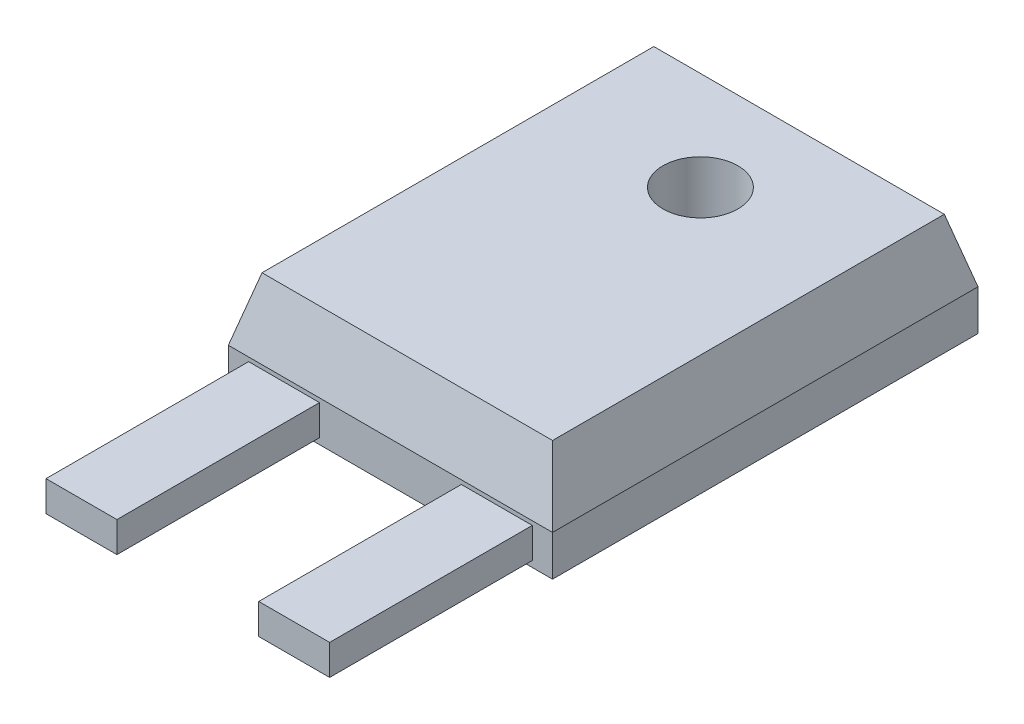
ISO-10303-21;
HEADER;
FILE_DESCRIPTION(('STEP AP214'),'2;1');
FILE_NAME('part.step','',(''),(''),'','','');
FILE_SCHEMA(('AUTOMOTIVE_DESIGN { 1 0 10303 214 1 1 1 1 }'));
ENDSEC;
DATA;
#1=APPLICATION_CONTEXT('core data for automotive mechanical design processes');
#2=APPLICATION_PROTOCOL_DEFINITION('international standard','automotive_design',2000,#1);
#3=PRODUCT_CONTEXT('',#1,'mechanical');
#4=PRODUCT('Part','Part','',(#3));
#5=PRODUCT_RELATED_PRODUCT_CATEGORY('part','',(#4));
#6=PRODUCT_DEFINITION_FORMATION('','',#4);
#7=PRODUCT_DEFINITION_CONTEXT('part definition',#1,'design');
#8=PRODUCT_DEFINITION('design','',#6,#7);
#9=PRODUCT_DEFINITION_SHAPE('','',#8);
#10=(LENGTH_UNIT() NAMED_UNIT(*) SI_UNIT(.MILLI.,.METRE.));
#11=(NAMED_UNIT(*) PLANE_ANGLE_UNIT() SI_UNIT($,.RADIAN.));
#12=(NAMED_UNIT(*) SI_UNIT($,.STERADIAN.) SOLID_ANGLE_UNIT());
#13=UNCERTAINTY_MEASURE_WITH_UNIT(LENGTH_MEASURE(1.E-05),#10,'distance_accuracy_value','');
#14=(GEOMETRIC_REPRESENTATION_CONTEXT(3) GLOBAL_UNCERTAINTY_ASSIGNED_CONTEXT((#13)) GLOBAL_UNIT_ASSIGNED_CONTEXT((#10,
#11,#12)) REPRESENTATION_CONTEXT('',''));
#15=CARTESIAN_POINT('',(0.,0.,0.));
#16=DIRECTION('',(0.,0.,1.));
#17=DIRECTION('',(1.,0.,0.));
#18=AXIS2_PLACEMENT_3D('',#15,#16,#17);
#19=CARTESIAN_POINT('',(0.,5.1,0.));
#20=DIRECTION('',(0.,0.,-1.));
#21=DIRECTION('',(-1.,0.,0.));
#22=AXIS2_PLACEMENT_3D('',#19,#20,#21);
#23=PLANE('',#22);
#24=DIRECTION('',(0.,-1.,0.));
#25=VECTOR('',#24,1.);
#26=CARTESIAN_POINT('',(1.,1.8,0.));
#27=LINE('',#26,#25);
#28=CARTESIAN_POINT('',(1.,1.8,0.));
#29=VERTEX_POINT('',#28);
#30=CARTESIAN_POINT('',(1.,0.3,0.));
#31=VERTEX_POINT('',#30);
#32=EDGE_CURVE('E227',#29,#31,#27,.T.);
#33=ORIENTED_EDGE('',*,*,#32,.F.);
#34=DIRECTION('',(-1.,0.,0.));
#35=VECTOR('',#34,1.);
#36=CARTESIAN_POINT('',(1.,1.8,0.));
#37=LINE('',#36,#35);
#38=CARTESIAN_POINT('',(4.5,1.8,0.));
#39=VERTEX_POINT('',#38);
#40=EDGE_CURVE('E232',#39,#29,#37,.T.);
#41=ORIENTED_EDGE('',*,*,#40,.F.);
#42=DIRECTION('',(0.,1.,0.));
#43=VECTOR('',#42,1.);
#44=CARTESIAN_POINT('',(4.5,1.8,0.));
#45=LINE('',#44,#43);
#46=CARTESIAN_POINT('',(4.5,0.3,0.));
#47=VERTEX_POINT('',#46);
#48=EDGE_CURVE('E244',#47,#39,#45,.T.);
#49=ORIENTED_EDGE('',*,*,#48,.F.);
#50=DIRECTION('',(1.,0.,0.));
#51=VECTOR('',#50,1.);
#52=CARTESIAN_POINT('',(1.,0.3,0.));
#53=LINE('',#52,#51);
#54=EDGE_CURVE('E241',#31,#47,#53,.T.);
#55=ORIENTED_EDGE('',*,*,#54,.F.);
#56=EDGE_LOOP('',(#33,#41,#49,#55));
#57=FACE_BOUND('',#56,.T.);
#58=DIRECTION('',(0.,-1.,0.));
#59=VECTOR('',#58,1.);
#60=CARTESIAN_POINT('',(16.,5.1,0.));
#61=LINE('',#60,#59);
#62=CARTESIAN_POINT('',(16.,1.99999999999996,0.));
#63=VERTEX_POINT('',#62);
#64=CARTESIAN_POINT('',(16.,0.,0.));
#65=VERTEX_POINT('',#64);
#66=EDGE_CURVE('E283',#63,#65,#61,.T.);
#67=ORIENTED_EDGE('',*,*,#66,.F.);
#68=DIRECTION('',(-1.,0.,0.));
#69=VECTOR('',#68,1.);
#70=CARTESIAN_POINT('',(0.,1.99999999999996,0.));
#71=LINE('',#70,#69);
#72=CARTESIAN_POINT('',(0.,1.99999999999996,0.));
#73=VERTEX_POINT('',#72);
#74=EDGE_CURVE('E296',#63,#73,#71,.T.);
#75=ORIENTED_EDGE('',*,*,#74,.T.);
#76=DIRECTION('',(0.,-1.,0.));
#77=VECTOR('',#76,1.);
#78=CARTESIAN_POINT('',(0.,5.1,0.));
#79=LINE('',#78,#77);
#80=CARTESIAN_POINT('',(0.,0.,0.));
#81=VERTEX_POINT('',#80);
#82=EDGE_CURVE('E285',#73,#81,#79,.T.);
#83=ORIENTED_EDGE('',*,*,#82,.T.);
#84=DIRECTION('',(1.,0.,0.));
#85=VECTOR('',#84,1.);
#86=CARTESIAN_POINT('',(0.,0.,0.));
#87=LINE('',#86,#85);
#88=EDGE_CURVE('E270',#81,#65,#87,.T.);
#89=ORIENTED_EDGE('',*,*,#88,.T.);
#90=EDGE_LOOP('',(#67,#75,#83,#89));
#91=FACE_BOUND('',#90,.T.);
#92=DIRECTION('',(0.,-1.,0.));
#93=VECTOR('',#92,1.);
#94=CARTESIAN_POINT('',(11.5,1.8,0.));
#95=LINE('',#94,#93);
#96=CARTESIAN_POINT('',(11.5,1.8,0.));
#97=VERTEX_POINT('',#96);
#98=CARTESIAN_POINT('',(11.5,0.3,0.));
#99=VERTEX_POINT('',#98);
#100=EDGE_CURVE('E194',#97,#99,#95,.T.);
#101=ORIENTED_EDGE('',*,*,#100,.F.);
#102=DIRECTION('',(-1.,0.,0.));
#103=VECTOR('',#102,1.);
#104=CARTESIAN_POINT('',(11.5,1.8,0.));
#105=LINE('',#104,#103);
#106=CARTESIAN_POINT('',(15.,1.8,0.));
#107=VERTEX_POINT('',#106);
#108=EDGE_CURVE('E202',#107,#97,#105,.T.);
#109=ORIENTED_EDGE('',*,*,#108,.F.);
#110=DIRECTION('',(0.,1.,0.));
#111=VECTOR('',#110,1.);
#112=CARTESIAN_POINT('',(15.,1.8,0.));
#113=LINE('',#112,#111);
#114=CARTESIAN_POINT('',(15.,0.3,0.));
#115=VERTEX_POINT('',#114);
#116=EDGE_CURVE('E212',#115,#107,#113,.T.);
#117=ORIENTED_EDGE('',*,*,#116,.F.);
#118=DIRECTION('',(1.,0.,0.));
#119=VECTOR('',#118,1.);
#120=CARTESIAN_POINT('',(11.5,0.3,0.));
#121=LINE('',#120,#119);
#122=EDGE_CURVE('E58',#99,#115,#121,.T.);
#123=ORIENTED_EDGE('',*,*,#122,.F.);
#124=EDGE_LOOP('',(#101,#109,#117,#123));
#125=FACE_BOUND('',#124,.T.);
#126=ADVANCED_FACE('F33',(#57,#91,#125),#23,.F.);
#127=CARTESIAN_POINT('',(0.,5.1,0.));
#128=DIRECTION('',(1.,0.,0.));
#129=DIRECTION('',(0.,0.,-1.));
#130=AXIS2_PLACEMENT_3D('',#127,#128,#129);
#131=PLANE('',#130);
#132=ORIENTED_EDGE('',*,*,#82,.F.);
#133=DIRECTION('',(0.,0.,-1.));
#134=VECTOR('',#133,1.);
#135=CARTESIAN_POINT('',(0.,1.99999999999996,0.));
#136=LINE('',#135,#134);
#137=CARTESIAN_POINT('',(0.,1.99999999999996,-21.));
#138=VERTEX_POINT('',#137);
#139=EDGE_CURVE('E299',#73,#138,#136,.T.);
#140=ORIENTED_EDGE('',*,*,#139,.T.);
#141=DIRECTION('',(0.,-1.,0.));
#142=VECTOR('',#141,1.);
#143=CARTESIAN_POINT('',(0.,5.1,-21.));
#144=LINE('',#143,#142);
#145=CARTESIAN_POINT('',(0.,0.,-21.));
#146=VERTEX_POINT('',#145);
#147=EDGE_CURVE('E279',#138,#146,#144,.T.);
#148=ORIENTED_EDGE('',*,*,#147,.T.);
#149=DIRECTION('',(0.,0.,1.));
#150=VECTOR('',#149,1.);
#151=CARTESIAN_POINT('',(0.,0.,0.));
#152=LINE('',#151,#150);
#153=EDGE_CURVE('E264',#146,#81,#152,.T.);
#154=ORIENTED_EDGE('',*,*,#153,.T.);
#155=EDGE_LOOP('',(#132,#140,#148,#154));
#156=FACE_BOUND('',#155,.T.);
#157=ADVANCED_FACE('F335',(#156),#131,.F.);
#158=CARTESIAN_POINT('',(16.,5.1,0.));
#159=DIRECTION('',(-1.,0.,0.));
#160=DIRECTION('',(0.,0.,1.));
#161=AXIS2_PLACEMENT_3D('',#158,#159,#160);
#162=PLANE('',#161);
#163=DIRECTION('',(0.,-1.,0.));
#164=VECTOR('',#163,1.);
#165=CARTESIAN_POINT('',(16.,5.1,-21.));
#166=LINE('',#165,#164);
#167=CARTESIAN_POINT('',(16.,1.99999999999996,-21.));
#168=VERTEX_POINT('',#167);
#169=CARTESIAN_POINT('',(16.,0.,-21.));
#170=VERTEX_POINT('',#169);
#171=EDGE_CURVE('E281',#168,#170,#166,.T.);
#172=ORIENTED_EDGE('',*,*,#171,.F.);
#173=DIRECTION('',(0.,0.,1.));
#174=VECTOR('',#173,1.);
#175=CARTESIAN_POINT('',(16.,1.99999999999996,0.));
#176=LINE('',#175,#174);
#177=EDGE_CURVE('E11',#168,#63,#176,.T.);
#178=ORIENTED_EDGE('',*,*,#177,.T.);
#179=ORIENTED_EDGE('',*,*,#66,.T.);
#180=DIRECTION('',(0.,0.,-1.));
#181=VECTOR('',#180,1.);
#182=CARTESIAN_POINT('',(16.,0.,0.));
#183=LINE('',#182,#181);
#184=EDGE_CURVE('E273',#65,#170,#183,.T.);
#185=ORIENTED_EDGE('',*,*,#184,.T.);
#186=EDGE_LOOP('',(#172,#178,#179,#185));
#187=FACE_BOUND('',#186,.T.);
#188=ADVANCED_FACE('F325',(#187),#162,.F.);
#189=CARTESIAN_POINT('',(0.,5.1,-21.));
#190=DIRECTION('',(0.,0.,1.));
#191=DIRECTION('',(1.,0.,0.));
#192=AXIS2_PLACEMENT_3D('',#189,#190,#191);
#193=PLANE('',#192);
#194=ORIENTED_EDGE('',*,*,#147,.F.);
#195=DIRECTION('',(1.,0.,0.));
#196=VECTOR('',#195,1.);
#197=CARTESIAN_POINT('',(0.,1.99999999999996,-21.));
#198=LINE('',#197,#196);
#199=EDGE_CURVE('E42',#138,#168,#198,.T.);
#200=ORIENTED_EDGE('',*,*,#199,.T.);
#201=ORIENTED_EDGE('',*,*,#171,.T.);
#202=DIRECTION('',(-1.,0.,0.));
#203=VECTOR('',#202,1.);
#204=CARTESIAN_POINT('',(0.,0.,-21.));
#205=LINE('',#204,#203);
#206=EDGE_CURVE('E276',#170,#146,#205,.T.);
#207=ORIENTED_EDGE('',*,*,#206,.T.);
#208=EDGE_LOOP('',(#194,#200,#201,#207));
#209=FACE_BOUND('',#208,.T.);
#210=ADVANCED_FACE('F323',(#209),#193,.F.);
#211=CARTESIAN_POINT('',(0.,5.1,0.));
#212=DIRECTION('',(0.,-1.,0.));
#213=DIRECTION('',(0.,0.,-1.));
#214=AXIS2_PLACEMENT_3D('',#211,#212,#213);
#215=PLANE('',#214);
#216=DIRECTION('',(0.,0.,1.));
#217=VECTOR('',#216,1.);
#218=CARTESIAN_POINT('',(0.830642496536483,5.1,0.));
#219=LINE('',#218,#217);
#220=CARTESIAN_POINT('',(0.830642496536483,5.1,-20.1693575034635));
#221=VERTEX_POINT('',#220);
#222=CARTESIAN_POINT('',(0.830642496536483,5.1,-0.830642496536483));
#223=VERTEX_POINT('',#222);
#224=EDGE_CURVE('E291',#221,#223,#219,.T.);
#225=ORIENTED_EDGE('',*,*,#224,.T.);
#226=DIRECTION('',(1.,0.,0.));
#227=VECTOR('',#226,1.);
#228=CARTESIAN_POINT('',(0.,5.1,-0.830642496536483));
#229=LINE('',#228,#227);
#230=CARTESIAN_POINT('',(15.1693575034635,5.1,-0.830642496536483));
#231=VERTEX_POINT('',#230);
#232=EDGE_CURVE('E293',#223,#231,#229,.T.);
#233=ORIENTED_EDGE('',*,*,#232,.T.);
#234=DIRECTION('',(0.,0.,-1.));
#235=VECTOR('',#234,1.);
#236=CARTESIAN_POINT('',(15.1693575034635,5.1,0.));
#237=LINE('',#236,#235);
#238=CARTESIAN_POINT('',(15.1693575034635,5.1,-20.1693575034635));
#239=VERTEX_POINT('',#238);
#240=EDGE_CURVE('E287',#231,#239,#237,.T.);
#241=ORIENTED_EDGE('',*,*,#240,.T.);
#242=DIRECTION('',(-1.,0.,0.));
#243=VECTOR('',#242,1.);
#244=CARTESIAN_POINT('',(0.,5.1,-20.1693575034635));
#245=LINE('',#244,#243);
#246=EDGE_CURVE('E289',#239,#221,#245,.T.);
#247=ORIENTED_EDGE('',*,*,#246,.T.);
#248=EDGE_LOOP('',(#225,#233,#241,#247));
#249=FACE_BOUND('',#248,.T.);
#250=CARTESIAN_POINT('',(8.,5.1,-15.3));
#251=DIRECTION('',(0.,1.,0.));
#252=DIRECTION('',(0.,0.,1.));
#253=AXIS2_PLACEMENT_3D('',#250,#251,#252);
#254=CIRCLE('',#253,1.85);
#255=CARTESIAN_POINT('',(8.,5.1,-13.45));
#256=VERTEX_POINT('',#255);
#257=EDGE_CURVE('E265',#256,#256,#254,.T.);
#258=ORIENTED_EDGE('',*,*,#257,.F.);
#259=EDGE_LOOP('',(#258));
#260=FACE_BOUND('',#259,.T.);
#261=ADVANCED_FACE('F344',(#249,#260),#215,.F.);
#262=CARTESIAN_POINT('',(0.,0.,0.));
#263=DIRECTION('',(0.,-1.,0.));
#264=DIRECTION('',(0.,0.,-1.));
#265=AXIS2_PLACEMENT_3D('',#262,#263,#264);
#266=PLANE('',#265);
#267=DIRECTION('',(0.,0.,1.));
#268=VECTOR('',#267,1.);
#269=CARTESIAN_POINT('',(14.9,0.,-12.6));
#270=LINE('',#269,#268);
#271=CARTESIAN_POINT('',(14.9,0.,-12.6));
#272=VERTEX_POINT('',#271);
#273=CARTESIAN_POINT('',(14.9,0.,-0.999999999999998));
#274=VERTEX_POINT('',#273);
#275=EDGE_CURVE('E50',#272,#274,#270,.T.);
#276=ORIENTED_EDGE('',*,*,#275,.F.);
#277=DIRECTION('',(1.,0.,0.));
#278=VECTOR('',#277,1.);
#279=CARTESIAN_POINT('',(14.9,0.,-12.6));
#280=LINE('',#279,#278);
#281=CARTESIAN_POINT('',(1.1,0.,-12.6));
#282=VERTEX_POINT('',#281);
#283=EDGE_CURVE('E179',#282,#272,#280,.T.);
#284=ORIENTED_EDGE('',*,*,#283,.F.);
#285=DIRECTION('',(0.,0.,-1.));
#286=VECTOR('',#285,1.);
#287=CARTESIAN_POINT('',(1.1,0.,-12.6));
#288=LINE('',#287,#286);
#289=CARTESIAN_POINT('',(1.1,0.,-0.999999999999998));
#290=VERTEX_POINT('',#289);
#291=EDGE_CURVE('E182',#290,#282,#288,.T.);
#292=ORIENTED_EDGE('',*,*,#291,.F.);
#293=DIRECTION('',(-1.,0.,0.));
#294=VECTOR('',#293,1.);
#295=CARTESIAN_POINT('',(14.9,0.,-0.999999999999998));
#296=LINE('',#295,#294);
#297=EDGE_CURVE('E188',#274,#290,#296,.T.);
#298=ORIENTED_EDGE('',*,*,#297,.F.);
#299=EDGE_LOOP('',(#276,#284,#292,#298));
#300=FACE_BOUND('',#299,.T.);
#301=CARTESIAN_POINT('',(8.,0.,-15.3));
#302=DIRECTION('',(0.,1.,0.));
#303=DIRECTION('',(0.,0.,1.));
#304=AXIS2_PLACEMENT_3D('',#301,#302,#303);
#305=CIRCLE('',#304,1.85);
#306=CARTESIAN_POINT('',(8.,0.,-13.45));
#307=VERTEX_POINT('',#306);
#308=EDGE_CURVE('E261',#307,#307,#305,.T.);
#309=ORIENTED_EDGE('',*,*,#308,.T.);
#310=EDGE_LOOP('',(#309));
#311=FACE_BOUND('',#310,.T.);
#312=ORIENTED_EDGE('',*,*,#153,.F.);
#313=ORIENTED_EDGE('',*,*,#206,.F.);
#314=ORIENTED_EDGE('',*,*,#184,.F.);
#315=ORIENTED_EDGE('',*,*,#88,.F.);
#316=EDGE_LOOP('',(#312,#313,#314,#315));
#317=FACE_BOUND('',#316,.T.);
#318=ADVANCED_FACE('F332',(#300,#311,#317),#266,.T.);
#319=CARTESIAN_POINT('',(8.,0.,-15.3));
#320=DIRECTION('',(0.,1.,0.));
#321=DIRECTION('',(0.,0.,1.));
#322=AXIS2_PLACEMENT_3D('',#319,#320,#321);
#323=CYLINDRICAL_SURFACE('',#322,1.85);
#324=ORIENTED_EDGE('',*,*,#308,.F.);
#325=EDGE_LOOP('',(#324));
#326=FACE_BOUND('',#325,.T.);
#327=ORIENTED_EDGE('',*,*,#257,.T.);
#328=EDGE_LOOP('',(#327));
#329=FACE_BOUND('',#328,.T.);
#330=ADVANCED_FACE('F350',(#326,#329),#323,.F.);
#331=CARTESIAN_POINT('',(0.,5.1,-20.1693575034635));
#332=DIRECTION('',(0.,-0.258819045102518,0.965925826289069));
#333=DIRECTION('',(-1.,0.,0.));
#334=AXIS2_PLACEMENT_3D('',#331,#332,#333);
#335=PLANE('',#334);
#336=DIRECTION('',(-0.25056280708573,0.935113126531031,0.250562807085729));
#337=VECTOR('',#336,1.);
#338=CARTESIAN_POINT('',(13.9030905421577,9.82577263553937,-18.9030905421577));
#339=LINE('',#338,#337);
#340=EDGE_CURVE('E304',#168,#239,#339,.T.);
#341=ORIENTED_EDGE('',*,*,#340,.F.);
#342=ORIENTED_EDGE('',*,*,#199,.F.);
#343=DIRECTION('',(0.25056280708573,0.935113126531031,0.250562807085729));
#344=VECTOR('',#343,1.);
#345=CARTESIAN_POINT('',(0.778493331654055,4.90537666708649,-20.2215066683459));
#346=LINE('',#345,#344);
#347=EDGE_CURVE('E37',#221,#138,#346,.F.);
#348=ORIENTED_EDGE('',*,*,#347,.F.);
#349=ORIENTED_EDGE('',*,*,#246,.F.);
#350=EDGE_LOOP('',(#341,#342,#348,#349));
#351=FACE_BOUND('',#350,.T.);
#352=ADVANCED_FACE('F35',(#351),#335,.F.);
#353=CARTESIAN_POINT('',(0.830642496536483,5.1,0.));
#354=DIRECTION('',(0.965925826289069,-0.258819045102518,0.));
#355=DIRECTION('',(0.,0.,1.));
#356=AXIS2_PLACEMENT_3D('',#353,#354,#355);
#357=PLANE('',#356);
#358=ORIENTED_EDGE('',*,*,#347,.T.);
#359=ORIENTED_EDGE('',*,*,#139,.F.);
#360=DIRECTION('',(0.250562807085729,0.935113126531031,-0.250562807085729));
#361=VECTOR('',#360,1.);
#362=CARTESIAN_POINT('',(0.778493331654055,4.90537666708649,-0.778493331654055));
#363=LINE('',#362,#361);
#364=EDGE_CURVE('E303',#223,#73,#363,.F.);
#365=ORIENTED_EDGE('',*,*,#364,.F.);
#366=ORIENTED_EDGE('',*,*,#224,.F.);
#367=EDGE_LOOP('',(#358,#359,#365,#366));
#368=FACE_BOUND('',#367,.T.);
#369=ADVANCED_FACE('F315',(#368),#357,.F.);
#370=CARTESIAN_POINT('',(15.1693575034635,5.1,0.));
#371=DIRECTION('',(-0.965925826289069,-0.258819045102518,0.));
#372=DIRECTION('',(0.,0.,-1.));
#373=AXIS2_PLACEMENT_3D('',#370,#371,#372);
#374=PLANE('',#373);
#375=ORIENTED_EDGE('',*,*,#340,.T.);
#376=ORIENTED_EDGE('',*,*,#240,.F.);
#377=DIRECTION('',(0.250562807085729,-0.935113126531031,0.250562807085729));
#378=VECTOR('',#377,1.);
#379=CARTESIAN_POINT('',(15.2215066683459,4.90537666708649,-0.778493331654055));
#380=LINE('',#379,#378);
#381=EDGE_CURVE('E260',#63,#231,#380,.F.);
#382=ORIENTED_EDGE('',*,*,#381,.F.);
#383=ORIENTED_EDGE('',*,*,#177,.F.);
#384=EDGE_LOOP('',(#375,#376,#382,#383));
#385=FACE_BOUND('',#384,.T.);
#386=ADVANCED_FACE('F342',(#385),#374,.F.);
#387=CARTESIAN_POINT('',(0.,5.1,-0.830642496536483));
#388=DIRECTION('',(0.,-0.258819045102518,-0.965925826289069));
#389=DIRECTION('',(1.,0.,0.));
#390=AXIS2_PLACEMENT_3D('',#387,#388,#389);
#391=PLANE('',#390);
#392=ORIENTED_EDGE('',*,*,#364,.T.);
#393=ORIENTED_EDGE('',*,*,#74,.F.);
#394=ORIENTED_EDGE('',*,*,#381,.T.);
#395=ORIENTED_EDGE('',*,*,#232,.F.);
#396=EDGE_LOOP('',(#392,#393,#394,#395));
#397=FACE_BOUND('',#396,.T.);
#398=ADVANCED_FACE('F340',(#397),#391,.F.);
#399=CARTESIAN_POINT('',(1.,1.8,10.));
#400=DIRECTION('',(1.,0.,0.));
#401=DIRECTION('',(0.,1.,0.));
#402=AXIS2_PLACEMENT_3D('',#399,#400,#401);
#403=PLANE('',#402);
#404=ORIENTED_EDGE('',*,*,#32,.T.);
#405=DIRECTION('',(0.,0.,-1.));
#406=VECTOR('',#405,1.);
#407=CARTESIAN_POINT('',(1.,0.3,10.));
#408=LINE('',#407,#406);
#409=CARTESIAN_POINT('',(1.,0.3,10.));
#410=VERTEX_POINT('',#409);
#411=EDGE_CURVE('E257',#410,#31,#408,.T.);
#412=ORIENTED_EDGE('',*,*,#411,.F.);
#413=DIRECTION('',(0.,-1.,0.));
#414=VECTOR('',#413,1.);
#415=CARTESIAN_POINT('',(1.,1.8,10.));
#416=LINE('',#415,#414);
#417=CARTESIAN_POINT('',(1.,1.8,10.));
#418=VERTEX_POINT('',#417);
#419=EDGE_CURVE('E228',#418,#410,#416,.T.);
#420=ORIENTED_EDGE('',*,*,#419,.F.);
#421=DIRECTION('',(0.,0.,-1.));
#422=VECTOR('',#421,1.);
#423=CARTESIAN_POINT('',(1.,1.8,10.));
#424=LINE('',#423,#422);
#425=EDGE_CURVE('E238',#418,#29,#424,.T.);
#426=ORIENTED_EDGE('',*,*,#425,.T.);
#427=EDGE_LOOP('',(#404,#412,#420,#426));
#428=FACE_BOUND('',#427,.T.);
#429=ADVANCED_FACE('F375',(#428),#403,.F.);
#430=CARTESIAN_POINT('',(1.,0.3,10.));
#431=DIRECTION('',(0.,1.,0.));
#432=DIRECTION('',(0.,0.,1.));
#433=AXIS2_PLACEMENT_3D('',#430,#431,#432);
#434=PLANE('',#433);
#435=ORIENTED_EDGE('',*,*,#54,.T.);
#436=DIRECTION('',(0.,0.,-1.));
#437=VECTOR('',#436,1.);
#438=CARTESIAN_POINT('',(4.5,0.3,10.));
#439=LINE('',#438,#437);
#440=CARTESIAN_POINT('',(4.5,0.3,10.));
#441=VERTEX_POINT('',#440);
#442=EDGE_CURVE('E254',#441,#47,#439,.T.);
#443=ORIENTED_EDGE('',*,*,#442,.F.);
#444=DIRECTION('',(1.,0.,0.));
#445=VECTOR('',#444,1.);
#446=CARTESIAN_POINT('',(1.,0.3,10.));
#447=LINE('',#446,#445);
#448=EDGE_CURVE('E231',#410,#441,#447,.T.);
#449=ORIENTED_EDGE('',*,*,#448,.F.);
#450=ORIENTED_EDGE('',*,*,#411,.T.);
#451=EDGE_LOOP('',(#435,#443,#449,#450));
#452=FACE_BOUND('',#451,.T.);
#453=ADVANCED_FACE('F396',(#452),#434,.F.);
#454=CARTESIAN_POINT('',(4.5,1.8,10.));
#455=DIRECTION('',(-1.,0.,0.));
#456=DIRECTION('',(0.,-1.,0.));
#457=AXIS2_PLACEMENT_3D('',#454,#455,#456);
#458=PLANE('',#457);
#459=ORIENTED_EDGE('',*,*,#48,.T.);
#460=DIRECTION('',(0.,0.,-1.));
#461=VECTOR('',#460,1.);
#462=CARTESIAN_POINT('',(4.5,1.8,10.));
#463=LINE('',#462,#461);
#464=CARTESIAN_POINT('',(4.5,1.8,10.));
#465=VERTEX_POINT('',#464);
#466=EDGE_CURVE('E251',#465,#39,#463,.T.);
#467=ORIENTED_EDGE('',*,*,#466,.F.);
#468=DIRECTION('',(0.,1.,0.));
#469=VECTOR('',#468,1.);
#470=CARTESIAN_POINT('',(4.5,1.8,10.));
#471=LINE('',#470,#469);
#472=EDGE_CURVE('E234',#441,#465,#471,.T.);
#473=ORIENTED_EDGE('',*,*,#472,.F.);
#474=ORIENTED_EDGE('',*,*,#442,.T.);
#475=EDGE_LOOP('',(#459,#467,#473,#474));
#476=FACE_BOUND('',#475,.T.);
#477=ADVANCED_FACE('F403',(#476),#458,.F.);
#478=CARTESIAN_POINT('',(1.,1.8,10.));
#479=DIRECTION('',(0.,-1.,0.));
#480=DIRECTION('',(0.,0.,-1.));
#481=AXIS2_PLACEMENT_3D('',#478,#479,#480);
#482=PLANE('',#481);
#483=ORIENTED_EDGE('',*,*,#40,.T.);
#484=ORIENTED_EDGE('',*,*,#425,.F.);
#485=DIRECTION('',(-1.,0.,0.));
#486=VECTOR('',#485,1.);
#487=CARTESIAN_POINT('',(1.,1.8,10.));
#488=LINE('',#487,#486);
#489=EDGE_CURVE('E236',#465,#418,#488,.T.);
#490=ORIENTED_EDGE('',*,*,#489,.F.);
#491=ORIENTED_EDGE('',*,*,#466,.T.);
#492=EDGE_LOOP('',(#483,#484,#490,#491));
#493=FACE_BOUND('',#492,.T.);
#494=ADVANCED_FACE('F411',(#493),#482,.F.);
#495=CARTESIAN_POINT('',(0.,0.,10.));
#496=DIRECTION('',(0.,0.,1.));
#497=DIRECTION('',(1.,0.,0.));
#498=AXIS2_PLACEMENT_3D('',#495,#496,#497);
#499=PLANE('',#498);
#500=ORIENTED_EDGE('',*,*,#419,.T.);
#501=ORIENTED_EDGE('',*,*,#448,.T.);
#502=ORIENTED_EDGE('',*,*,#472,.T.);
#503=ORIENTED_EDGE('',*,*,#489,.T.);
#504=EDGE_LOOP('',(#500,#501,#502,#503));
#505=FACE_BOUND('',#504,.T.);
#506=ADVANCED_FACE('F419',(#505),#499,.T.);
#507=CARTESIAN_POINT('',(11.5,1.8,10.));
#508=DIRECTION('',(1.,0.,0.));
#509=DIRECTION('',(0.,0.,-1.));
#510=AXIS2_PLACEMENT_3D('',#507,#508,#509);
#511=PLANE('',#510);
#512=ORIENTED_EDGE('',*,*,#100,.T.);
#513=DIRECTION('',(0.,0.,-1.));
#514=VECTOR('',#513,1.);
#515=CARTESIAN_POINT('',(11.5,0.3,10.));
#516=LINE('',#515,#514);
#517=CARTESIAN_POINT('',(11.5,0.3,10.));
#518=VERTEX_POINT('',#517);
#519=EDGE_CURVE('E225',#518,#99,#516,.T.);
#520=ORIENTED_EDGE('',*,*,#519,.F.);
#521=DIRECTION('',(0.,-1.,0.));
#522=VECTOR('',#521,1.);
#523=CARTESIAN_POINT('',(11.5,1.8,10.));
#524=LINE('',#523,#522);
#525=CARTESIAN_POINT('',(11.5,1.8,10.));
#526=VERTEX_POINT('',#525);
#527=EDGE_CURVE('E198',#526,#518,#524,.T.);
#528=ORIENTED_EDGE('',*,*,#527,.F.);
#529=DIRECTION('',(0.,0.,-1.));
#530=VECTOR('',#529,1.);
#531=CARTESIAN_POINT('',(11.5,1.8,10.));
#532=LINE('',#531,#530);
#533=EDGE_CURVE('E208',#526,#97,#532,.T.);
#534=ORIENTED_EDGE('',*,*,#533,.T.);
#535=EDGE_LOOP('',(#512,#520,#528,#534));
#536=FACE_BOUND('',#535,.T.);
#537=ADVANCED_FACE('F427',(#536),#511,.F.);
#538=CARTESIAN_POINT('',(11.5,0.3,10.));
#539=DIRECTION('',(0.,1.,0.));
#540=DIRECTION('',(0.,0.,1.));
#541=AXIS2_PLACEMENT_3D('',#538,#539,#540);
#542=PLANE('',#541);
#543=ORIENTED_EDGE('',*,*,#122,.T.);
#544=DIRECTION('',(0.,0.,-1.));
#545=VECTOR('',#544,1.);
#546=CARTESIAN_POINT('',(15.,0.3,10.));
#547=LINE('',#546,#545);
#548=CARTESIAN_POINT('',(15.,0.3,10.));
#549=VERTEX_POINT('',#548);
#550=EDGE_CURVE('E222',#549,#115,#547,.T.);
#551=ORIENTED_EDGE('',*,*,#550,.F.);
#552=DIRECTION('',(1.,0.,0.));
#553=VECTOR('',#552,1.);
#554=CARTESIAN_POINT('',(11.5,0.3,10.));
#555=LINE('',#554,#553);
#556=EDGE_CURVE('E201',#518,#549,#555,.T.);
#557=ORIENTED_EDGE('',*,*,#556,.F.);
#558=ORIENTED_EDGE('',*,*,#519,.T.);
#559=EDGE_LOOP('',(#543,#551,#557,#558));
#560=FACE_BOUND('',#559,.T.);
#561=ADVANCED_FACE('F435',(#560),#542,.F.);
#562=CARTESIAN_POINT('',(15.,1.8,10.));
#563=DIRECTION('',(-1.,0.,0.));
#564=DIRECTION('',(0.,0.,1.));
#565=AXIS2_PLACEMENT_3D('',#562,#563,#564);
#566=PLANE('',#565);
#567=ORIENTED_EDGE('',*,*,#116,.T.);
#568=DIRECTION('',(0.,0.,-1.));
#569=VECTOR('',#568,1.);
#570=CARTESIAN_POINT('',(15.,1.8,10.));
#571=LINE('',#570,#569);
#572=CARTESIAN_POINT('',(15.,1.8,10.));
#573=VERTEX_POINT('',#572);
#574=EDGE_CURVE('E219',#573,#107,#571,.T.);
#575=ORIENTED_EDGE('',*,*,#574,.F.);
#576=DIRECTION('',(0.,1.,0.));
#577=VECTOR('',#576,1.);
#578=CARTESIAN_POINT('',(15.,1.8,10.));
#579=LINE('',#578,#577);
#580=EDGE_CURVE('E204',#549,#573,#579,.T.);
#581=ORIENTED_EDGE('',*,*,#580,.F.);
#582=ORIENTED_EDGE('',*,*,#550,.T.);
#583=EDGE_LOOP('',(#567,#575,#581,#582));
#584=FACE_BOUND('',#583,.T.);
#585=ADVANCED_FACE('F443',(#584),#566,.F.);
#586=CARTESIAN_POINT('',(11.5,1.8,10.));
#587=DIRECTION('',(0.,-1.,0.));
#588=DIRECTION('',(0.,0.,-1.));
#589=AXIS2_PLACEMENT_3D('',#586,#587,#588);
#590=PLANE('',#589);
#591=ORIENTED_EDGE('',*,*,#108,.T.);
#592=ORIENTED_EDGE('',*,*,#533,.F.);
#593=DIRECTION('',(-1.,0.,0.));
#594=VECTOR('',#593,1.);
#595=CARTESIAN_POINT('',(11.5,1.8,10.));
#596=LINE('',#595,#594);
#597=EDGE_CURVE('E206',#573,#526,#596,.T.);
#598=ORIENTED_EDGE('',*,*,#597,.F.);
#599=ORIENTED_EDGE('',*,*,#574,.T.);
#600=EDGE_LOOP('',(#591,#592,#598,#599));
#601=FACE_BOUND('',#600,.T.);
#602=ADVANCED_FACE('F451',(#601),#590,.F.);
#603=CARTESIAN_POINT('',(0.,0.,10.));
#604=DIRECTION('',(0.,0.,1.));
#605=DIRECTION('',(1.,0.,0.));
#606=AXIS2_PLACEMENT_3D('',#603,#604,#605);
#607=PLANE('',#606);
#608=ORIENTED_EDGE('',*,*,#527,.T.);
#609=ORIENTED_EDGE('',*,*,#556,.T.);
#610=ORIENTED_EDGE('',*,*,#580,.T.);
#611=ORIENTED_EDGE('',*,*,#597,.T.);
#612=EDGE_LOOP('',(#608,#609,#610,#611));
#613=FACE_BOUND('',#612,.T.);
#614=ADVANCED_FACE('F459',(#613),#607,.T.);
#615=CARTESIAN_POINT('',(14.9,0.5,-12.6));
#616=DIRECTION('',(1.,0.,0.));
#617=DIRECTION('',(0.,0.,-1.));
#618=AXIS2_PLACEMENT_3D('',#615,#616,#617);
#619=PLANE('',#618);
#620=ORIENTED_EDGE('',*,*,#275,.T.);
#621=DIRECTION('',(0.,-1.,0.));
#622=VECTOR('',#621,1.);
#623=CARTESIAN_POINT('',(14.9,0.5,-0.999999999999998));
#624=LINE('',#623,#622);
#625=CARTESIAN_POINT('',(14.9,0.5,-0.999999999999998));
#626=VERTEX_POINT('',#625);
#627=EDGE_CURVE('E157',#626,#274,#624,.T.);
#628=ORIENTED_EDGE('',*,*,#627,.F.);
#629=DIRECTION('',(0.,0.,1.));
#630=VECTOR('',#629,1.);
#631=CARTESIAN_POINT('',(14.9,0.5,-12.6));
#632=LINE('',#631,#630);
#633=CARTESIAN_POINT('',(14.9,0.5,-12.6));
#634=VERTEX_POINT('',#633);
#635=EDGE_CURVE('E161',#634,#626,#632,.T.);
#636=ORIENTED_EDGE('',*,*,#635,.F.);
#637=DIRECTION('',(0.,-1.,0.));
#638=VECTOR('',#637,1.);
#639=CARTESIAN_POINT('',(14.9,0.5,-12.6));
#640=LINE('',#639,#638);
#641=EDGE_CURVE('E192',#634,#272,#640,.T.);
#642=ORIENTED_EDGE('',*,*,#641,.T.);
#643=EDGE_LOOP('',(#620,#628,#636,#642));
#644=FACE_BOUND('',#643,.T.);
#645=ADVANCED_FACE('F159',(#644),#619,.F.);
#646=CARTESIAN_POINT('',(14.9,0.5,-12.6));
#647=DIRECTION('',(0.,0.,-1.));
#648=DIRECTION('',(-1.,0.,0.));
#649=AXIS2_PLACEMENT_3D('',#646,#647,#648);
#650=PLANE('',#649);
#651=ORIENTED_EDGE('',*,*,#283,.T.);
#652=ORIENTED_EDGE('',*,*,#641,.F.);
#653=DIRECTION('',(1.,0.,0.));
#654=VECTOR('',#653,1.);
#655=CARTESIAN_POINT('',(14.9,0.5,-12.6));
#656=LINE('',#655,#654);
#657=CARTESIAN_POINT('',(1.1,0.5,-12.6));
#658=VERTEX_POINT('',#657);
#659=EDGE_CURVE('E167',#658,#634,#656,.T.);
#660=ORIENTED_EDGE('',*,*,#659,.F.);
#661=DIRECTION('',(0.,-1.,0.));
#662=VECTOR('',#661,1.);
#663=CARTESIAN_POINT('',(1.1,0.5,-12.6));
#664=LINE('',#663,#662);
#665=EDGE_CURVE('E195',#658,#282,#664,.T.);
#666=ORIENTED_EDGE('',*,*,#665,.T.);
#667=EDGE_LOOP('',(#651,#652,#660,#666));
#668=FACE_BOUND('',#667,.T.);
#669=ADVANCED_FACE('F474',(#668),#650,.F.);
#670=CARTESIAN_POINT('',(1.1,0.5,-12.6));
#671=DIRECTION('',(-1.,0.,0.));
#672=DIRECTION('',(0.,0.,1.));
#673=AXIS2_PLACEMENT_3D('',#670,#671,#672);
#674=PLANE('',#673);
#675=ORIENTED_EDGE('',*,*,#291,.T.);
#676=ORIENTED_EDGE('',*,*,#665,.F.);
#677=DIRECTION('',(0.,0.,-1.));
#678=VECTOR('',#677,1.);
#679=CARTESIAN_POINT('',(1.1,0.5,-12.6));
#680=LINE('',#679,#678);
#681=CARTESIAN_POINT('',(1.1,0.5,-0.999999999999998));
#682=VERTEX_POINT('',#681);
#683=EDGE_CURVE('E175',#682,#658,#680,.T.);
#684=ORIENTED_EDGE('',*,*,#683,.F.);
#685=DIRECTION('',(0.,-1.,0.));
#686=VECTOR('',#685,1.);
#687=CARTESIAN_POINT('',(1.1,0.5,-0.999999999999998));
#688=LINE('',#687,#686);
#689=EDGE_CURVE('E166',#682,#290,#688,.T.);
#690=ORIENTED_EDGE('',*,*,#689,.T.);
#691=EDGE_LOOP('',(#675,#676,#684,#690));
#692=FACE_BOUND('',#691,.T.);
#693=ADVANCED_FACE('F481',(#692),#674,.F.);
#694=CARTESIAN_POINT('',(14.9,0.5,-0.999999999999998));
#695=DIRECTION('',(0.,0.,1.));
#696=DIRECTION('',(1.,0.,0.));
#697=AXIS2_PLACEMENT_3D('',#694,#695,#696);
#698=PLANE('',#697);
#699=ORIENTED_EDGE('',*,*,#297,.T.);
#700=ORIENTED_EDGE('',*,*,#689,.F.);
#701=DIRECTION('',(-1.,0.,0.));
#702=VECTOR('',#701,1.);
#703=CARTESIAN_POINT('',(14.9,0.5,-0.999999999999998));
#704=LINE('',#703,#702);
#705=EDGE_CURVE('E170',#626,#682,#704,.T.);
#706=ORIENTED_EDGE('',*,*,#705,.F.);
#707=ORIENTED_EDGE('',*,*,#627,.T.);
#708=EDGE_LOOP('',(#699,#700,#706,#707));
#709=FACE_BOUND('',#708,.T.);
#710=ADVANCED_FACE('F171',(#709),#698,.F.);
#711=CARTESIAN_POINT('',(0.,0.5,0.));
#712=DIRECTION('',(0.,-1.,0.));
#713=DIRECTION('',(0.,0.,-1.));
#714=AXIS2_PLACEMENT_3D('',#711,#712,#713);
#715=PLANE('',#714);
#716=ORIENTED_EDGE('',*,*,#635,.T.);
#717=ORIENTED_EDGE('',*,*,#705,.T.);
#718=ORIENTED_EDGE('',*,*,#683,.T.);
#719=ORIENTED_EDGE('',*,*,#659,.T.);
#720=EDGE_LOOP('',(#716,#717,#718,#719));
#721=FACE_BOUND('',#720,.T.);
#722=ADVANCED_FACE('F177',(#721),#715,.T.);
#723=CLOSED_SHELL('',(#126,#157,#188,#210,#261,#318,#330,#352,#369,#386,#398,#429,#453,#477,
#494,#506,#537,#561,#585,#602,#614,#645,#669,#693,#710,#722));
#724=MANIFOLD_SOLID_BREP('B2',#723);
#725=ADVANCED_BREP_SHAPE_REPRESENTATION('',(#18,#724),#14);
#726=SHAPE_DEFINITION_REPRESENTATION(#9,#725);
ENDSEC;
END-ISO-10303-21;
